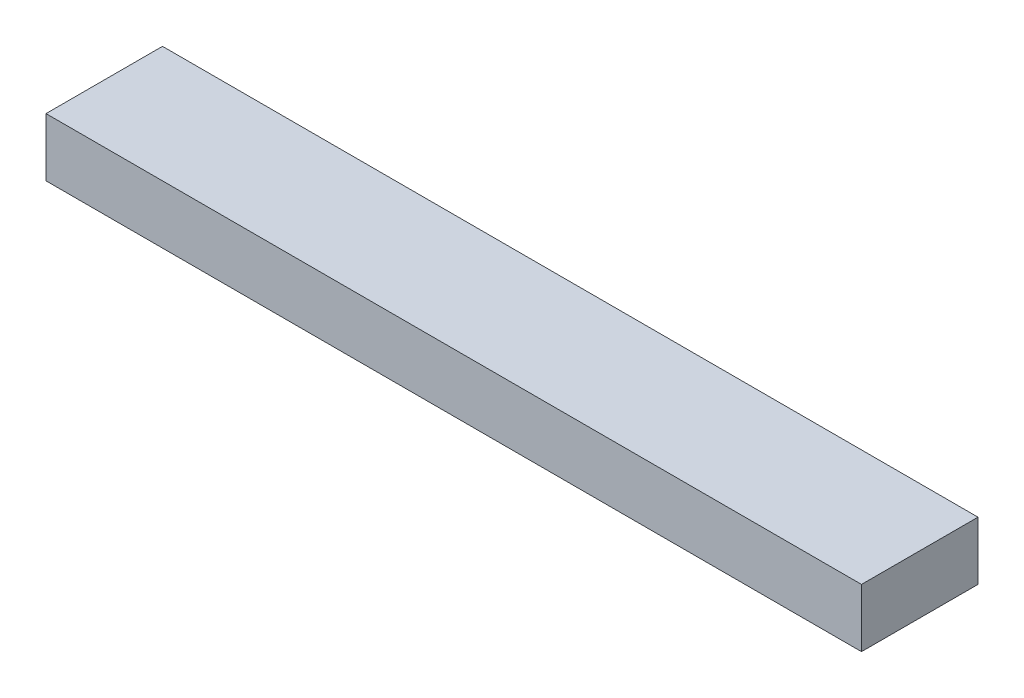
ISO-10303-21;
HEADER;
FILE_DESCRIPTION(('STEP AP214'),'2;1');
FILE_NAME('part.step','',(''),(''),'','','');
FILE_SCHEMA(('AUTOMOTIVE_DESIGN { 1 0 10303 214 1 1 1 1 }'));
ENDSEC;
DATA;
#1=APPLICATION_CONTEXT('core data for automotive mechanical design processes');
#2=APPLICATION_PROTOCOL_DEFINITION('international standard','automotive_design',2000,#1);
#3=PRODUCT_CONTEXT('',#1,'mechanical');
#4=PRODUCT('Part','Part','',(#3));
#5=PRODUCT_RELATED_PRODUCT_CATEGORY('part','',(#4));
#6=PRODUCT_DEFINITION_FORMATION('','',#4);
#7=PRODUCT_DEFINITION_CONTEXT('part definition',#1,'design');
#8=PRODUCT_DEFINITION('design','',#6,#7);
#9=PRODUCT_DEFINITION_SHAPE('','',#8);
#10=(LENGTH_UNIT() NAMED_UNIT(*) SI_UNIT(.MILLI.,.METRE.));
#11=(NAMED_UNIT(*) PLANE_ANGLE_UNIT() SI_UNIT($,.RADIAN.));
#12=(NAMED_UNIT(*) SI_UNIT($,.STERADIAN.) SOLID_ANGLE_UNIT());
#13=UNCERTAINTY_MEASURE_WITH_UNIT(LENGTH_MEASURE(1.E-05),#10,'distance_accuracy_value','');
#14=(GEOMETRIC_REPRESENTATION_CONTEXT(3) GLOBAL_UNCERTAINTY_ASSIGNED_CONTEXT((#13)) GLOBAL_UNIT_ASSIGNED_CONTEXT((#10,
#11,#12)) REPRESENTATION_CONTEXT('',''));
#15=CARTESIAN_POINT('',(0.,0.,0.));
#16=DIRECTION('',(0.,0.,1.));
#17=DIRECTION('',(1.,0.,0.));
#18=AXIS2_PLACEMENT_3D('',#15,#16,#17);
#19=CARTESIAN_POINT('',(0.,12.7,0.));
#20=DIRECTION('',(1.,0.,0.));
#21=DIRECTION('',(0.,0.,-1.));
#22=AXIS2_PLACEMENT_3D('',#19,#20,#21);
#23=PLANE('',#22);
#24=DIRECTION('',(0.,0.,1.));
#25=VECTOR('',#24,1.);
#26=CARTESIAN_POINT('',(0.,0.,0.));
#27=LINE('',#26,#25);
#28=CARTESIAN_POINT('',(0.,0.,-25.4));
#29=VERTEX_POINT('',#28);
#30=CARTESIAN_POINT('',(0.,0.,0.));
#31=VERTEX_POINT('',#30);
#32=EDGE_CURVE('E107',#29,#31,#27,.T.);
#33=ORIENTED_EDGE('',*,*,#32,.T.);
#34=DIRECTION('',(0.,-1.,0.));
#35=VECTOR('',#34,1.);
#36=CARTESIAN_POINT('',(0.,12.7,0.));
#37=LINE('',#36,#35);
#38=CARTESIAN_POINT('',(0.,12.7,0.));
#39=VERTEX_POINT('',#38);
#40=EDGE_CURVE('E11',#39,#31,#37,.T.);
#41=ORIENTED_EDGE('',*,*,#40,.F.);
#42=DIRECTION('',(0.,0.,1.));
#43=VECTOR('',#42,1.);
#44=CARTESIAN_POINT('',(0.,12.7,0.));
#45=LINE('',#44,#43);
#46=CARTESIAN_POINT('',(0.,12.7,-25.4));
#47=VERTEX_POINT('',#46);
#48=EDGE_CURVE('E91',#47,#39,#45,.T.);
#49=ORIENTED_EDGE('',*,*,#48,.F.);
#50=DIRECTION('',(0.,-1.,0.));
#51=VECTOR('',#50,1.);
#52=CARTESIAN_POINT('',(0.,12.7,-25.4));
#53=LINE('',#52,#51);
#54=EDGE_CURVE('E103',#47,#29,#53,.T.);
#55=ORIENTED_EDGE('',*,*,#54,.T.);
#56=EDGE_LOOP('',(#33,#41,#49,#55));
#57=FACE_BOUND('',#56,.T.);
#58=ADVANCED_FACE('F39',(#57),#23,.F.);
#59=CARTESIAN_POINT('',(0.,12.7,0.));
#60=DIRECTION('',(0.,0.,-1.));
#61=DIRECTION('',(-1.,0.,0.));
#62=AXIS2_PLACEMENT_3D('',#59,#60,#61);
#63=PLANE('',#62);
#64=DIRECTION('',(1.,0.,0.));
#65=VECTOR('',#64,1.);
#66=CARTESIAN_POINT('',(0.,0.,0.));
#67=LINE('',#66,#65);
#68=CARTESIAN_POINT('',(177.8,0.,0.));
#69=VERTEX_POINT('',#68);
#70=EDGE_CURVE('E96',#31,#69,#67,.T.);
#71=ORIENTED_EDGE('',*,*,#70,.T.);
#72=DIRECTION('',(0.,-1.,0.));
#73=VECTOR('',#72,1.);
#74=CARTESIAN_POINT('',(177.8,12.7,0.));
#75=LINE('',#74,#73);
#76=CARTESIAN_POINT('',(177.8,12.7,0.));
#77=VERTEX_POINT('',#76);
#78=EDGE_CURVE('E48',#77,#69,#75,.T.);
#79=ORIENTED_EDGE('',*,*,#78,.F.);
#80=DIRECTION('',(1.,0.,0.));
#81=VECTOR('',#80,1.);
#82=CARTESIAN_POINT('',(0.,12.7,0.));
#83=LINE('',#82,#81);
#84=EDGE_CURVE('E86',#39,#77,#83,.T.);
#85=ORIENTED_EDGE('',*,*,#84,.F.);
#86=ORIENTED_EDGE('',*,*,#40,.T.);
#87=EDGE_LOOP('',(#71,#79,#85,#86));
#88=FACE_BOUND('',#87,.T.);
#89=ADVANCED_FACE('F95',(#88),#63,.F.);
#90=CARTESIAN_POINT('',(177.8,12.7,0.));
#91=DIRECTION('',(-1.,0.,0.));
#92=DIRECTION('',(0.,0.,1.));
#93=AXIS2_PLACEMENT_3D('',#90,#91,#92);
#94=PLANE('',#93);
#95=DIRECTION('',(0.,0.,-1.));
#96=VECTOR('',#95,1.);
#97=CARTESIAN_POINT('',(177.8,0.,0.));
#98=LINE('',#97,#96);
#99=CARTESIAN_POINT('',(177.8,0.,-25.4));
#100=VERTEX_POINT('',#99);
#101=EDGE_CURVE('E73',#69,#100,#98,.T.);
#102=ORIENTED_EDGE('',*,*,#101,.T.);
#103=DIRECTION('',(0.,-1.,0.));
#104=VECTOR('',#103,1.);
#105=CARTESIAN_POINT('',(177.8,12.7,-25.4));
#106=LINE('',#105,#104);
#107=CARTESIAN_POINT('',(177.8,12.7,-25.4));
#108=VERTEX_POINT('',#107);
#109=EDGE_CURVE('E98',#108,#100,#106,.T.);
#110=ORIENTED_EDGE('',*,*,#109,.F.);
#111=DIRECTION('',(0.,0.,-1.));
#112=VECTOR('',#111,1.);
#113=CARTESIAN_POINT('',(177.8,12.7,0.));
#114=LINE('',#113,#112);
#115=EDGE_CURVE('E89',#77,#108,#114,.T.);
#116=ORIENTED_EDGE('',*,*,#115,.F.);
#117=ORIENTED_EDGE('',*,*,#78,.T.);
#118=EDGE_LOOP('',(#102,#110,#116,#117));
#119=FACE_BOUND('',#118,.T.);
#120=ADVANCED_FACE('F99',(#119),#94,.F.);
#121=CARTESIAN_POINT('',(0.,12.7,-25.4));
#122=DIRECTION('',(0.,0.,1.));
#123=DIRECTION('',(1.,0.,0.));
#124=AXIS2_PLACEMENT_3D('',#121,#122,#123);
#125=PLANE('',#124);
#126=DIRECTION('',(-1.,0.,0.));
#127=VECTOR('',#126,1.);
#128=CARTESIAN_POINT('',(0.,0.,-25.4));
#129=LINE('',#128,#127);
#130=EDGE_CURVE('E79',#100,#29,#129,.T.);
#131=ORIENTED_EDGE('',*,*,#130,.T.);
#132=ORIENTED_EDGE('',*,*,#54,.F.);
#133=DIRECTION('',(-1.,0.,0.));
#134=VECTOR('',#133,1.);
#135=CARTESIAN_POINT('',(0.,12.7,-25.4));
#136=LINE('',#135,#134);
#137=EDGE_CURVE('E56',#108,#47,#136,.T.);
#138=ORIENTED_EDGE('',*,*,#137,.F.);
#139=ORIENTED_EDGE('',*,*,#109,.T.);
#140=EDGE_LOOP('',(#131,#132,#138,#139));
#141=FACE_BOUND('',#140,.T.);
#142=ADVANCED_FACE('F120',(#141),#125,.F.);
#143=CARTESIAN_POINT('',(0.,12.7,0.));
#144=DIRECTION('',(0.,-1.,0.));
#145=DIRECTION('',(0.,0.,-1.));
#146=AXIS2_PLACEMENT_3D('',#143,#144,#145);
#147=PLANE('',#146);
#148=ORIENTED_EDGE('',*,*,#48,.T.);
#149=ORIENTED_EDGE('',*,*,#84,.T.);
#150=ORIENTED_EDGE('',*,*,#115,.T.);
#151=ORIENTED_EDGE('',*,*,#137,.T.);
#152=EDGE_LOOP('',(#148,#149,#150,#151));
#153=FACE_BOUND('',#152,.T.);
#154=ADVANCED_FACE('F87',(#153),#147,.F.);
#155=CARTESIAN_POINT('',(0.,0.,0.));
#156=DIRECTION('',(0.,-1.,0.));
#157=DIRECTION('',(0.,0.,-1.));
#158=AXIS2_PLACEMENT_3D('',#155,#156,#157);
#159=PLANE('',#158);
#160=ORIENTED_EDGE('',*,*,#32,.F.);
#161=ORIENTED_EDGE('',*,*,#130,.F.);
#162=ORIENTED_EDGE('',*,*,#101,.F.);
#163=ORIENTED_EDGE('',*,*,#70,.F.);
#164=EDGE_LOOP('',(#160,#161,#162,#163));
#165=FACE_BOUND('',#164,.T.);
#166=ADVANCED_FACE('F123',(#165),#159,.T.);
#167=CLOSED_SHELL('',(#58,#89,#120,#142,#154,#166));
#168=MANIFOLD_SOLID_BREP('B2',#167);
#169=ADVANCED_BREP_SHAPE_REPRESENTATION('',(#18,#168),#14);
#170=SHAPE_DEFINITION_REPRESENTATION(#9,#169);
ENDSEC;
END-ISO-10303-21;
